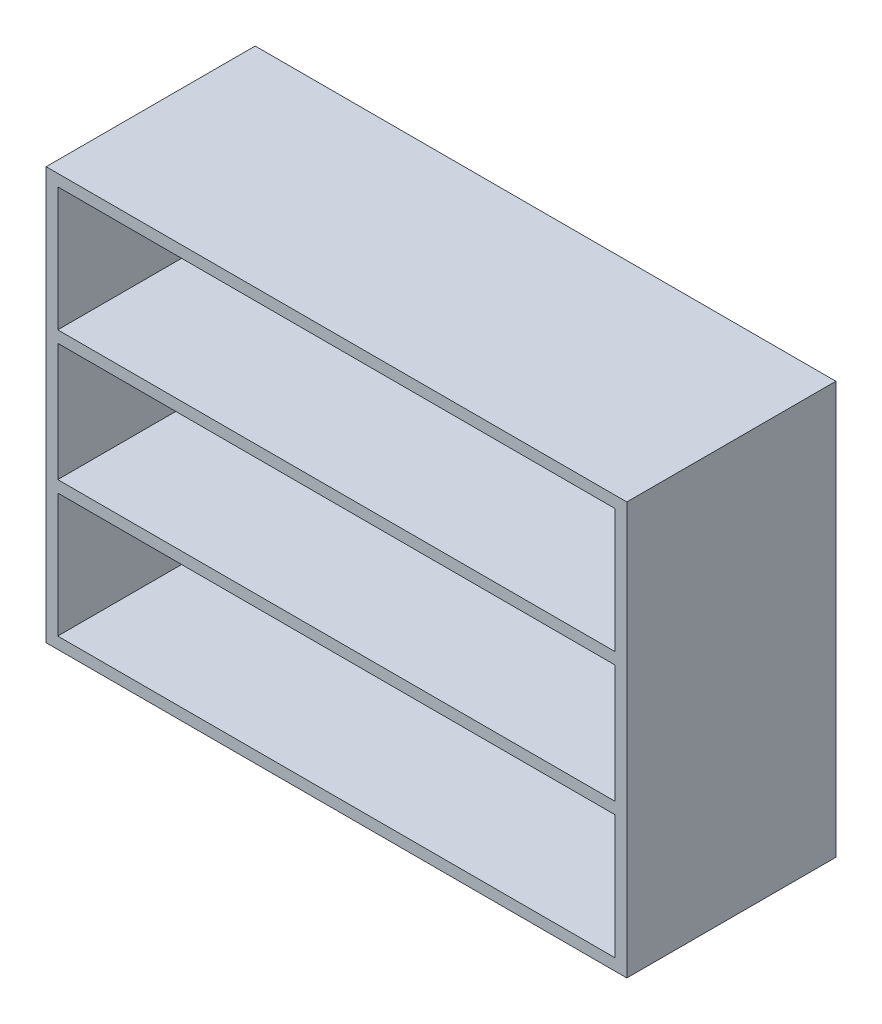
ISO-10303-21;
HEADER;
FILE_DESCRIPTION(('STEP AP214'),'2;1');
FILE_NAME('part.step','',(''),(''),'','','');
FILE_SCHEMA(('AUTOMOTIVE_DESIGN { 1 0 10303 214 1 1 1 1 }'));
ENDSEC;
DATA;
#1=APPLICATION_CONTEXT('core data for automotive mechanical design processes');
#2=APPLICATION_PROTOCOL_DEFINITION('international standard','automotive_design',2000,#1);
#3=PRODUCT_CONTEXT('',#1,'mechanical');
#4=PRODUCT('Part','Part','',(#3));
#5=PRODUCT_RELATED_PRODUCT_CATEGORY('part','',(#4));
#6=PRODUCT_DEFINITION_FORMATION('','',#4);
#7=PRODUCT_DEFINITION_CONTEXT('part definition',#1,'design');
#8=PRODUCT_DEFINITION('design','',#6,#7);
#9=PRODUCT_DEFINITION_SHAPE('','',#8);
#10=(LENGTH_UNIT() NAMED_UNIT(*) SI_UNIT(.MILLI.,.METRE.));
#11=(NAMED_UNIT(*) PLANE_ANGLE_UNIT() SI_UNIT($,.RADIAN.));
#12=(NAMED_UNIT(*) SI_UNIT($,.STERADIAN.) SOLID_ANGLE_UNIT());
#13=UNCERTAINTY_MEASURE_WITH_UNIT(LENGTH_MEASURE(1.E-05),#10,'distance_accuracy_value','');
#14=(GEOMETRIC_REPRESENTATION_CONTEXT(3) GLOBAL_UNCERTAINTY_ASSIGNED_CONTEXT((#13)) GLOBAL_UNIT_ASSIGNED_CONTEXT((#10,
#11,#12)) REPRESENTATION_CONTEXT('',''));
#15=CARTESIAN_POINT('',(0.,0.,0.));
#16=DIRECTION('',(0.,0.,1.));
#17=DIRECTION('',(1.,0.,0.));
#18=AXIS2_PLACEMENT_3D('',#15,#16,#17);
#19=CARTESIAN_POINT('',(1270.,1803.4,-457.2));
#20=DIRECTION('',(-1.,0.,0.));
#21=DIRECTION('',(0.,0.,1.));
#22=AXIS2_PLACEMENT_3D('',#19,#20,#21);
#23=PLANE('',#22);
#24=DIRECTION('',(0.,0.,-1.));
#25=VECTOR('',#24,1.);
#26=CARTESIAN_POINT('',(1270.,0.,-457.2));
#27=LINE('',#26,#25);
#28=CARTESIAN_POINT('',(1270.,0.,457.2));
#29=VERTEX_POINT('',#28);
#30=CARTESIAN_POINT('',(1270.,0.,-457.2));
#31=VERTEX_POINT('',#30);
#32=EDGE_CURVE('E182',#29,#31,#27,.T.);
#33=ORIENTED_EDGE('',*,*,#32,.T.);
#34=DIRECTION('',(0.,-1.,0.));
#35=VECTOR('',#34,1.);
#36=CARTESIAN_POINT('',(1270.,1803.4,-457.2));
#37=LINE('',#36,#35);
#38=CARTESIAN_POINT('',(1270.,1803.4,-457.2));
#39=VERTEX_POINT('',#38);
#40=EDGE_CURVE('E11',#39,#31,#37,.T.);
#41=ORIENTED_EDGE('',*,*,#40,.F.);
#42=DIRECTION('',(0.,0.,-1.));
#43=VECTOR('',#42,1.);
#44=CARTESIAN_POINT('',(1270.,1803.4,-457.2));
#45=LINE('',#44,#43);
#46=CARTESIAN_POINT('',(1270.,1803.4,457.2));
#47=VERTEX_POINT('',#46);
#48=EDGE_CURVE('E247',#47,#39,#45,.T.);
#49=ORIENTED_EDGE('',*,*,#48,.F.);
#50=DIRECTION('',(0.,-1.,0.));
#51=VECTOR('',#50,1.);
#52=CARTESIAN_POINT('',(1270.,1803.4,457.2));
#53=LINE('',#52,#51);
#54=EDGE_CURVE('E257',#47,#29,#53,.T.);
#55=ORIENTED_EDGE('',*,*,#54,.T.);
#56=EDGE_LOOP('',(#33,#41,#49,#55));
#57=FACE_BOUND('',#56,.T.);
#58=ADVANCED_FACE('F32',(#57),#23,.F.);
#59=CARTESIAN_POINT('',(-1270.,1803.4,-457.2));
#60=DIRECTION('',(0.,0.,1.));
#61=DIRECTION('',(1.,0.,0.));
#62=AXIS2_PLACEMENT_3D('',#59,#60,#61);
#63=PLANE('',#62);
#64=DIRECTION('',(-1.,0.,0.));
#65=VECTOR('',#64,1.);
#66=CARTESIAN_POINT('',(-1219.2,592.666666666667,-457.2));
#67=LINE('',#66,#65);
#68=CARTESIAN_POINT('',(1219.2,592.666666666667,-457.2));
#69=VERTEX_POINT('',#68);
#70=CARTESIAN_POINT('',(-1219.2,592.666666666667,-457.2));
#71=VERTEX_POINT('',#70);
#72=EDGE_CURVE('E156',#69,#71,#67,.T.);
#73=ORIENTED_EDGE('',*,*,#72,.T.);
#74=DIRECTION('',(0.,-1.,0.));
#75=VECTOR('',#74,1.);
#76=CARTESIAN_POINT('',(-1219.2,592.666666666667,-457.2));
#77=LINE('',#76,#75);
#78=CARTESIAN_POINT('',(-1219.2,50.8,-457.2));
#79=VERTEX_POINT('',#78);
#80=EDGE_CURVE('E148',#71,#79,#77,.T.);
#81=ORIENTED_EDGE('',*,*,#80,.T.);
#82=DIRECTION('',(1.,0.,0.));
#83=VECTOR('',#82,1.);
#84=CARTESIAN_POINT('',(-1219.2,50.8,-457.2));
#85=LINE('',#84,#83);
#86=CARTESIAN_POINT('',(1219.2,50.8000000000001,-457.2));
#87=VERTEX_POINT('',#86);
#88=EDGE_CURVE('E159',#79,#87,#85,.T.);
#89=ORIENTED_EDGE('',*,*,#88,.T.);
#90=DIRECTION('',(0.,1.,0.));
#91=VECTOR('',#90,1.);
#92=CARTESIAN_POINT('',(1219.2,50.8000000000001,-457.2));
#93=LINE('',#92,#91);
#94=EDGE_CURVE('E46',#87,#69,#93,.T.);
#95=ORIENTED_EDGE('',*,*,#94,.T.);
#96=EDGE_LOOP('',(#73,#81,#89,#95));
#97=FACE_BOUND('',#96,.T.);
#98=DIRECTION('',(1.,0.,0.));
#99=VECTOR('',#98,1.);
#100=CARTESIAN_POINT('',(-1219.2,1210.73333333333,-457.2));
#101=LINE('',#100,#99);
#102=CARTESIAN_POINT('',(-1219.2,1210.73333333333,-457.2));
#103=VERTEX_POINT('',#102);
#104=CARTESIAN_POINT('',(1219.2,1210.73333333333,-457.2));
#105=VERTEX_POINT('',#104);
#106=EDGE_CURVE('E194',#103,#105,#101,.T.);
#107=ORIENTED_EDGE('',*,*,#106,.T.);
#108=DIRECTION('',(0.,1.,0.));
#109=VECTOR('',#108,1.);
#110=CARTESIAN_POINT('',(1219.2,1210.73333333333,-457.2));
#111=LINE('',#110,#109);
#112=CARTESIAN_POINT('',(1219.2,1752.6,-457.2));
#113=VERTEX_POINT('',#112);
#114=EDGE_CURVE('E186',#105,#113,#111,.T.);
#115=ORIENTED_EDGE('',*,*,#114,.T.);
#116=DIRECTION('',(-1.,0.,0.));
#117=VECTOR('',#116,1.);
#118=CARTESIAN_POINT('',(1219.2,1752.6,-457.2));
#119=LINE('',#118,#117);
#120=CARTESIAN_POINT('',(-1219.2,1752.6,-457.2));
#121=VERTEX_POINT('',#120);
#122=EDGE_CURVE('E189',#113,#121,#119,.T.);
#123=ORIENTED_EDGE('',*,*,#122,.T.);
#124=DIRECTION('',(0.,-1.,0.));
#125=VECTOR('',#124,1.);
#126=CARTESIAN_POINT('',(-1219.2,1752.6,-457.2));
#127=LINE('',#126,#125);
#128=EDGE_CURVE('E54',#121,#103,#127,.T.);
#129=ORIENTED_EDGE('',*,*,#128,.T.);
#130=EDGE_LOOP('',(#107,#115,#123,#129));
#131=FACE_BOUND('',#130,.T.);
#132=DIRECTION('',(-1.,0.,0.));
#133=VECTOR('',#132,1.);
#134=CARTESIAN_POINT('',(-1219.2,1159.93333333333,-457.2));
#135=LINE('',#134,#133);
#136=CARTESIAN_POINT('',(1219.2,1159.93333333333,-457.2));
#137=VERTEX_POINT('',#136);
#138=CARTESIAN_POINT('',(-1219.2,1159.93333333333,-457.2));
#139=VERTEX_POINT('',#138);
#140=EDGE_CURVE('E226',#137,#139,#135,.T.);
#141=ORIENTED_EDGE('',*,*,#140,.T.);
#142=DIRECTION('',(0.,-1.,0.));
#143=VECTOR('',#142,1.);
#144=CARTESIAN_POINT('',(-1219.2,1159.93333333333,-457.2));
#145=LINE('',#144,#143);
#146=CARTESIAN_POINT('',(-1219.2,643.466666666667,-457.2));
#147=VERTEX_POINT('',#146);
#148=EDGE_CURVE('E216',#139,#147,#145,.T.);
#149=ORIENTED_EDGE('',*,*,#148,.T.);
#150=DIRECTION('',(1.,0.,0.));
#151=VECTOR('',#150,1.);
#152=CARTESIAN_POINT('',(-1219.2,643.466666666667,-457.2));
#153=LINE('',#152,#151);
#154=CARTESIAN_POINT('',(1219.2,643.466666666667,-457.2));
#155=VERTEX_POINT('',#154);
#156=EDGE_CURVE('E219',#147,#155,#153,.T.);
#157=ORIENTED_EDGE('',*,*,#156,.T.);
#158=DIRECTION('',(0.,1.,0.));
#159=VECTOR('',#158,1.);
#160=CARTESIAN_POINT('',(1219.2,643.466666666667,-457.2));
#161=LINE('',#160,#159);
#162=EDGE_CURVE('E223',#155,#137,#161,.T.);
#163=ORIENTED_EDGE('',*,*,#162,.T.);
#164=EDGE_LOOP('',(#141,#149,#157,#163));
#165=FACE_BOUND('',#164,.T.);
#166=DIRECTION('',(-1.,0.,0.));
#167=VECTOR('',#166,1.);
#168=CARTESIAN_POINT('',(-1270.,0.,-457.2));
#169=LINE('',#168,#167);
#170=CARTESIAN_POINT('',(-1270.,0.,-457.2));
#171=VERTEX_POINT('',#170);
#172=EDGE_CURVE('E260',#31,#171,#169,.T.);
#173=ORIENTED_EDGE('',*,*,#172,.T.);
#174=DIRECTION('',(0.,-1.,0.));
#175=VECTOR('',#174,1.);
#176=CARTESIAN_POINT('',(-1270.,1803.4,-457.2));
#177=LINE('',#176,#175);
#178=CARTESIAN_POINT('',(-1270.,1803.4,-457.2));
#179=VERTEX_POINT('',#178);
#180=EDGE_CURVE('E39',#179,#171,#177,.T.);
#181=ORIENTED_EDGE('',*,*,#180,.F.);
#182=DIRECTION('',(-1.,0.,0.));
#183=VECTOR('',#182,1.);
#184=CARTESIAN_POINT('',(-1270.,1803.4,-457.2));
#185=LINE('',#184,#183);
#186=EDGE_CURVE('E250',#39,#179,#185,.T.);
#187=ORIENTED_EDGE('',*,*,#186,.F.);
#188=ORIENTED_EDGE('',*,*,#40,.T.);
#189=EDGE_LOOP('',(#173,#181,#187,#188));
#190=FACE_BOUND('',#189,.T.);
#191=ADVANCED_FACE('F163',(#97,#131,#165,#190),#63,.F.);
#192=CARTESIAN_POINT('',(-1270.,1803.4,-457.2));
#193=DIRECTION('',(1.,0.,0.));
#194=DIRECTION('',(0.,0.,-1.));
#195=AXIS2_PLACEMENT_3D('',#192,#193,#194);
#196=PLANE('',#195);
#197=DIRECTION('',(0.,0.,1.));
#198=VECTOR('',#197,1.);
#199=CARTESIAN_POINT('',(-1270.,0.,-457.2));
#200=LINE('',#199,#198);
#201=CARTESIAN_POINT('',(-1270.,0.,457.2));
#202=VERTEX_POINT('',#201);
#203=EDGE_CURVE('E262',#171,#202,#200,.T.);
#204=ORIENTED_EDGE('',*,*,#203,.T.);
#205=DIRECTION('',(0.,-1.,0.));
#206=VECTOR('',#205,1.);
#207=CARTESIAN_POINT('',(-1270.,1803.4,457.2));
#208=LINE('',#207,#206);
#209=CARTESIAN_POINT('',(-1270.,1803.4,457.2));
#210=VERTEX_POINT('',#209);
#211=EDGE_CURVE('E267',#210,#202,#208,.T.);
#212=ORIENTED_EDGE('',*,*,#211,.F.);
#213=DIRECTION('',(0.,0.,1.));
#214=VECTOR('',#213,1.);
#215=CARTESIAN_POINT('',(-1270.,1803.4,-457.2));
#216=LINE('',#215,#214);
#217=EDGE_CURVE('E253',#179,#210,#216,.T.);
#218=ORIENTED_EDGE('',*,*,#217,.F.);
#219=ORIENTED_EDGE('',*,*,#180,.T.);
#220=EDGE_LOOP('',(#204,#212,#218,#219));
#221=FACE_BOUND('',#220,.T.);
#222=ADVANCED_FACE('F274',(#221),#196,.F.);
#223=CARTESIAN_POINT('',(-1270.,1803.4,457.2));
#224=DIRECTION('',(0.,0.,-1.));
#225=DIRECTION('',(-1.,0.,0.));
#226=AXIS2_PLACEMENT_3D('',#223,#224,#225);
#227=PLANE('',#226);
#228=DIRECTION('',(1.,0.,0.));
#229=VECTOR('',#228,1.);
#230=CARTESIAN_POINT('',(-1219.2,50.8,457.2));
#231=LINE('',#230,#229);
#232=CARTESIAN_POINT('',(-1219.2,50.8,457.2));
#233=VERTEX_POINT('',#232);
#234=CARTESIAN_POINT('',(1219.2,50.8000000000001,457.2));
#235=VERTEX_POINT('',#234);
#236=EDGE_CURVE('E175',#233,#235,#231,.T.);
#237=ORIENTED_EDGE('',*,*,#236,.F.);
#238=DIRECTION('',(0.,-1.,0.));
#239=VECTOR('',#238,1.);
#240=CARTESIAN_POINT('',(-1219.2,592.666666666667,457.2));
#241=LINE('',#240,#239);
#242=CARTESIAN_POINT('',(-1219.2,592.666666666667,457.2));
#243=VERTEX_POINT('',#242);
#244=EDGE_CURVE('E151',#243,#233,#241,.T.);
#245=ORIENTED_EDGE('',*,*,#244,.F.);
#246=DIRECTION('',(-1.,0.,0.));
#247=VECTOR('',#246,1.);
#248=CARTESIAN_POINT('',(-1219.2,592.666666666667,457.2));
#249=LINE('',#248,#247);
#250=CARTESIAN_POINT('',(1219.2,592.666666666667,457.2));
#251=VERTEX_POINT('',#250);
#252=EDGE_CURVE('E166',#251,#243,#249,.T.);
#253=ORIENTED_EDGE('',*,*,#252,.F.);
#254=DIRECTION('',(0.,1.,0.));
#255=VECTOR('',#254,1.);
#256=CARTESIAN_POINT('',(1219.2,50.8000000000001,457.2));
#257=LINE('',#256,#255);
#258=EDGE_CURVE('E169',#235,#251,#257,.T.);
#259=ORIENTED_EDGE('',*,*,#258,.F.);
#260=EDGE_LOOP('',(#237,#245,#253,#259));
#261=FACE_BOUND('',#260,.T.);
#262=DIRECTION('',(-1.,0.,0.));
#263=VECTOR('',#262,1.);
#264=CARTESIAN_POINT('',(1219.2,1752.6,457.2));
#265=LINE('',#264,#263);
#266=CARTESIAN_POINT('',(1219.2,1752.6,457.2));
#267=VERTEX_POINT('',#266);
#268=CARTESIAN_POINT('',(-1219.2,1752.6,457.2));
#269=VERTEX_POINT('',#268);
#270=EDGE_CURVE('E200',#267,#269,#265,.T.);
#271=ORIENTED_EDGE('',*,*,#270,.F.);
#272=DIRECTION('',(0.,1.,0.));
#273=VECTOR('',#272,1.);
#274=CARTESIAN_POINT('',(1219.2,1210.73333333333,457.2));
#275=LINE('',#274,#273);
#276=CARTESIAN_POINT('',(1219.2,1210.73333333333,457.2));
#277=VERTEX_POINT('',#276);
#278=EDGE_CURVE('E198',#277,#267,#275,.T.);
#279=ORIENTED_EDGE('',*,*,#278,.F.);
#280=DIRECTION('',(1.,0.,0.));
#281=VECTOR('',#280,1.);
#282=CARTESIAN_POINT('',(-1219.2,1210.73333333333,457.2));
#283=LINE('',#282,#281);
#284=CARTESIAN_POINT('',(-1219.2,1210.73333333333,457.2));
#285=VERTEX_POINT('',#284);
#286=EDGE_CURVE('E190',#285,#277,#283,.T.);
#287=ORIENTED_EDGE('',*,*,#286,.F.);
#288=DIRECTION('',(0.,-1.,0.));
#289=VECTOR('',#288,1.);
#290=CARTESIAN_POINT('',(-1219.2,1752.6,457.2));
#291=LINE('',#290,#289);
#292=EDGE_CURVE('E204',#269,#285,#291,.T.);
#293=ORIENTED_EDGE('',*,*,#292,.F.);
#294=EDGE_LOOP('',(#271,#279,#287,#293));
#295=FACE_BOUND('',#294,.T.);
#296=DIRECTION('',(1.,0.,0.));
#297=VECTOR('',#296,1.);
#298=CARTESIAN_POINT('',(-1219.2,643.466666666667,457.2));
#299=LINE('',#298,#297);
#300=CARTESIAN_POINT('',(-1219.2,643.466666666667,457.2));
#301=VERTEX_POINT('',#300);
#302=CARTESIAN_POINT('',(1219.2,643.466666666667,457.2));
#303=VERTEX_POINT('',#302);
#304=EDGE_CURVE('E232',#301,#303,#299,.T.);
#305=ORIENTED_EDGE('',*,*,#304,.F.);
#306=DIRECTION('',(0.,-1.,0.));
#307=VECTOR('',#306,1.);
#308=CARTESIAN_POINT('',(-1219.2,1159.93333333333,457.2));
#309=LINE('',#308,#307);
#310=CARTESIAN_POINT('',(-1219.2,1159.93333333333,457.2));
#311=VERTEX_POINT('',#310);
#312=EDGE_CURVE('E230',#311,#301,#309,.T.);
#313=ORIENTED_EDGE('',*,*,#312,.F.);
#314=DIRECTION('',(-1.,0.,0.));
#315=VECTOR('',#314,1.);
#316=CARTESIAN_POINT('',(-1219.2,1159.93333333333,457.2));
#317=LINE('',#316,#315);
#318=CARTESIAN_POINT('',(1219.2,1159.93333333333,457.2));
#319=VERTEX_POINT('',#318);
#320=EDGE_CURVE('E220',#319,#311,#317,.T.);
#321=ORIENTED_EDGE('',*,*,#320,.F.);
#322=DIRECTION('',(0.,1.,0.));
#323=VECTOR('',#322,1.);
#324=CARTESIAN_POINT('',(1219.2,643.466666666667,457.2));
#325=LINE('',#324,#323);
#326=EDGE_CURVE('E235',#303,#319,#325,.T.);
#327=ORIENTED_EDGE('',*,*,#326,.F.);
#328=EDGE_LOOP('',(#305,#313,#321,#327));
#329=FACE_BOUND('',#328,.T.);
#330=DIRECTION('',(1.,0.,0.));
#331=VECTOR('',#330,1.);
#332=CARTESIAN_POINT('',(-1270.,0.,457.2));
#333=LINE('',#332,#331);
#334=EDGE_CURVE('E251',#202,#29,#333,.T.);
#335=ORIENTED_EDGE('',*,*,#334,.T.);
#336=ORIENTED_EDGE('',*,*,#54,.F.);
#337=DIRECTION('',(1.,0.,0.));
#338=VECTOR('',#337,1.);
#339=CARTESIAN_POINT('',(-1270.,1803.4,457.2));
#340=LINE('',#339,#338);
#341=EDGE_CURVE('E255',#210,#47,#340,.T.);
#342=ORIENTED_EDGE('',*,*,#341,.F.);
#343=ORIENTED_EDGE('',*,*,#211,.T.);
#344=EDGE_LOOP('',(#335,#336,#342,#343));
#345=FACE_BOUND('',#344,.T.);
#346=ADVANCED_FACE('F283',(#261,#295,#329,#345),#227,.F.);
#347=CARTESIAN_POINT('',(0.,1803.4,0.));
#348=DIRECTION('',(0.,1.,0.));
#349=DIRECTION('',(0.,0.,1.));
#350=AXIS2_PLACEMENT_3D('',#347,#348,#349);
#351=PLANE('',#350);
#352=ORIENTED_EDGE('',*,*,#48,.T.);
#353=ORIENTED_EDGE('',*,*,#186,.T.);
#354=ORIENTED_EDGE('',*,*,#217,.T.);
#355=ORIENTED_EDGE('',*,*,#341,.T.);
#356=EDGE_LOOP('',(#352,#353,#354,#355));
#357=FACE_BOUND('',#356,.T.);
#358=ADVANCED_FACE('F289',(#357),#351,.T.);
#359=CARTESIAN_POINT('',(0.,0.,0.));
#360=DIRECTION('',(0.,1.,0.));
#361=DIRECTION('',(0.,0.,1.));
#362=AXIS2_PLACEMENT_3D('',#359,#360,#361);
#363=PLANE('',#362);
#364=ORIENTED_EDGE('',*,*,#32,.F.);
#365=ORIENTED_EDGE('',*,*,#334,.F.);
#366=ORIENTED_EDGE('',*,*,#203,.F.);
#367=ORIENTED_EDGE('',*,*,#172,.F.);
#368=EDGE_LOOP('',(#364,#365,#366,#367));
#369=FACE_BOUND('',#368,.T.);
#370=ADVANCED_FACE('F280',(#369),#363,.F.);
#371=CARTESIAN_POINT('',(-1219.2,1159.93333333333,-457.2));
#372=DIRECTION('',(-1.,0.,0.));
#373=DIRECTION('',(0.,-1.,0.));
#374=AXIS2_PLACEMENT_3D('',#371,#372,#373);
#375=PLANE('',#374);
#376=ORIENTED_EDGE('',*,*,#312,.T.);
#377=DIRECTION('',(0.,0.,1.));
#378=VECTOR('',#377,1.);
#379=CARTESIAN_POINT('',(-1219.2,643.466666666667,-457.2));
#380=LINE('',#379,#378);
#381=EDGE_CURVE('E229',#147,#301,#380,.T.);
#382=ORIENTED_EDGE('',*,*,#381,.F.);
#383=ORIENTED_EDGE('',*,*,#148,.F.);
#384=DIRECTION('',(0.,0.,1.));
#385=VECTOR('',#384,1.);
#386=CARTESIAN_POINT('',(-1219.2,1159.93333333333,-457.2));
#387=LINE('',#386,#385);
#388=EDGE_CURVE('E201',#139,#311,#387,.T.);
#389=ORIENTED_EDGE('',*,*,#388,.T.);
#390=EDGE_LOOP('',(#376,#382,#383,#389));
#391=FACE_BOUND('',#390,.T.);
#392=ADVANCED_FACE('F302',(#391),#375,.F.);
#393=CARTESIAN_POINT('',(-1219.2,1159.93333333333,-457.2));
#394=DIRECTION('',(0.,1.,0.));
#395=DIRECTION('',(0.,0.,1.));
#396=AXIS2_PLACEMENT_3D('',#393,#394,#395);
#397=PLANE('',#396);
#398=ORIENTED_EDGE('',*,*,#320,.T.);
#399=ORIENTED_EDGE('',*,*,#388,.F.);
#400=ORIENTED_EDGE('',*,*,#140,.F.);
#401=DIRECTION('',(0.,0.,1.));
#402=VECTOR('',#401,1.);
#403=CARTESIAN_POINT('',(1219.2,1159.93333333333,-457.2));
#404=LINE('',#403,#402);
#405=EDGE_CURVE('E241',#137,#319,#404,.T.);
#406=ORIENTED_EDGE('',*,*,#405,.T.);
#407=EDGE_LOOP('',(#398,#399,#400,#406));
#408=FACE_BOUND('',#407,.T.);
#409=ADVANCED_FACE('F307',(#408),#397,.F.);
#410=CARTESIAN_POINT('',(1219.2,643.466666666667,-457.2));
#411=DIRECTION('',(1.,0.,0.));
#412=DIRECTION('',(0.,1.,0.));
#413=AXIS2_PLACEMENT_3D('',#410,#411,#412);
#414=PLANE('',#413);
#415=ORIENTED_EDGE('',*,*,#326,.T.);
#416=ORIENTED_EDGE('',*,*,#405,.F.);
#417=ORIENTED_EDGE('',*,*,#162,.F.);
#418=DIRECTION('',(0.,0.,1.));
#419=VECTOR('',#418,1.);
#420=CARTESIAN_POINT('',(1219.2,643.466666666667,-457.2));
#421=LINE('',#420,#419);
#422=EDGE_CURVE('E243',#155,#303,#421,.T.);
#423=ORIENTED_EDGE('',*,*,#422,.T.);
#424=EDGE_LOOP('',(#415,#416,#417,#423));
#425=FACE_BOUND('',#424,.T.);
#426=ADVANCED_FACE('F313',(#425),#414,.F.);
#427=CARTESIAN_POINT('',(-1219.2,643.466666666667,-457.2));
#428=DIRECTION('',(0.,-1.,0.));
#429=DIRECTION('',(0.,0.,-1.));
#430=AXIS2_PLACEMENT_3D('',#427,#428,#429);
#431=PLANE('',#430);
#432=ORIENTED_EDGE('',*,*,#304,.T.);
#433=ORIENTED_EDGE('',*,*,#422,.F.);
#434=ORIENTED_EDGE('',*,*,#156,.F.);
#435=ORIENTED_EDGE('',*,*,#381,.T.);
#436=EDGE_LOOP('',(#432,#433,#434,#435));
#437=FACE_BOUND('',#436,.T.);
#438=ADVANCED_FACE('F309',(#437),#431,.F.);
#439=CARTESIAN_POINT('',(1219.2,1210.73333333333,-457.2));
#440=DIRECTION('',(1.,0.,0.));
#441=DIRECTION('',(0.,1.,0.));
#442=AXIS2_PLACEMENT_3D('',#439,#440,#441);
#443=PLANE('',#442);
#444=ORIENTED_EDGE('',*,*,#278,.T.);
#445=DIRECTION('',(0.,0.,1.));
#446=VECTOR('',#445,1.);
#447=CARTESIAN_POINT('',(1219.2,1752.6,-457.2));
#448=LINE('',#447,#446);
#449=EDGE_CURVE('E197',#113,#267,#448,.T.);
#450=ORIENTED_EDGE('',*,*,#449,.F.);
#451=ORIENTED_EDGE('',*,*,#114,.F.);
#452=DIRECTION('',(0.,0.,1.));
#453=VECTOR('',#452,1.);
#454=CARTESIAN_POINT('',(1219.2,1210.73333333333,-457.2));
#455=LINE('',#454,#453);
#456=EDGE_CURVE('E176',#105,#277,#455,.T.);
#457=ORIENTED_EDGE('',*,*,#456,.T.);
#458=EDGE_LOOP('',(#444,#450,#451,#457));
#459=FACE_BOUND('',#458,.T.);
#460=ADVANCED_FACE('F312',(#459),#443,.F.);
#461=CARTESIAN_POINT('',(-1219.2,1210.73333333333,-457.2));
#462=DIRECTION('',(0.,-1.,0.));
#463=DIRECTION('',(0.,0.,-1.));
#464=AXIS2_PLACEMENT_3D('',#461,#462,#463);
#465=PLANE('',#464);
#466=ORIENTED_EDGE('',*,*,#286,.T.);
#467=ORIENTED_EDGE('',*,*,#456,.F.);
#468=ORIENTED_EDGE('',*,*,#106,.F.);
#469=DIRECTION('',(0.,0.,1.));
#470=VECTOR('',#469,1.);
#471=CARTESIAN_POINT('',(-1219.2,1210.73333333333,-457.2));
#472=LINE('',#471,#470);
#473=EDGE_CURVE('E210',#103,#285,#472,.T.);
#474=ORIENTED_EDGE('',*,*,#473,.T.);
#475=EDGE_LOOP('',(#466,#467,#468,#474));
#476=FACE_BOUND('',#475,.T.);
#477=ADVANCED_FACE('F323',(#476),#465,.F.);
#478=CARTESIAN_POINT('',(-1219.2,1752.6,-457.2));
#479=DIRECTION('',(-1.,0.,0.));
#480=DIRECTION('',(0.,-1.,0.));
#481=AXIS2_PLACEMENT_3D('',#478,#479,#480);
#482=PLANE('',#481);
#483=ORIENTED_EDGE('',*,*,#292,.T.);
#484=ORIENTED_EDGE('',*,*,#473,.F.);
#485=ORIENTED_EDGE('',*,*,#128,.F.);
#486=DIRECTION('',(0.,0.,1.));
#487=VECTOR('',#486,1.);
#488=CARTESIAN_POINT('',(-1219.2,1752.6,-457.2));
#489=LINE('',#488,#487);
#490=EDGE_CURVE('E212',#121,#269,#489,.T.);
#491=ORIENTED_EDGE('',*,*,#490,.T.);
#492=EDGE_LOOP('',(#483,#484,#485,#491));
#493=FACE_BOUND('',#492,.T.);
#494=ADVANCED_FACE('F328',(#493),#482,.F.);
#495=CARTESIAN_POINT('',(1219.2,1752.6,-457.2));
#496=DIRECTION('',(0.,1.,0.));
#497=DIRECTION('',(-1.,0.,0.));
#498=AXIS2_PLACEMENT_3D('',#495,#496,#497);
#499=PLANE('',#498);
#500=ORIENTED_EDGE('',*,*,#270,.T.);
#501=ORIENTED_EDGE('',*,*,#490,.F.);
#502=ORIENTED_EDGE('',*,*,#122,.F.);
#503=ORIENTED_EDGE('',*,*,#449,.T.);
#504=EDGE_LOOP('',(#500,#501,#502,#503));
#505=FACE_BOUND('',#504,.T.);
#506=ADVANCED_FACE('F325',(#505),#499,.F.);
#507=CARTESIAN_POINT('',(-1219.2,592.666666666667,-457.2));
#508=DIRECTION('',(-1.,0.,0.));
#509=DIRECTION('',(0.,-1.,0.));
#510=AXIS2_PLACEMENT_3D('',#507,#508,#509);
#511=PLANE('',#510);
#512=ORIENTED_EDGE('',*,*,#244,.T.);
#513=DIRECTION('',(0.,0.,1.));
#514=VECTOR('',#513,1.);
#515=CARTESIAN_POINT('',(-1219.2,50.8,-457.2));
#516=LINE('',#515,#514);
#517=EDGE_CURVE('E144',#79,#233,#516,.T.);
#518=ORIENTED_EDGE('',*,*,#517,.F.);
#519=ORIENTED_EDGE('',*,*,#80,.F.);
#520=DIRECTION('',(0.,0.,1.));
#521=VECTOR('',#520,1.);
#522=CARTESIAN_POINT('',(-1219.2,592.666666666667,-457.2));
#523=LINE('',#522,#521);
#524=EDGE_CURVE('E180',#71,#243,#523,.T.);
#525=ORIENTED_EDGE('',*,*,#524,.T.);
#526=EDGE_LOOP('',(#512,#518,#519,#525));
#527=FACE_BOUND('',#526,.T.);
#528=ADVANCED_FACE('F146',(#527),#511,.F.);
#529=CARTESIAN_POINT('',(-1219.2,592.666666666667,-457.2));
#530=DIRECTION('',(0.,1.,0.));
#531=DIRECTION('',(0.,0.,1.));
#532=AXIS2_PLACEMENT_3D('',#529,#530,#531);
#533=PLANE('',#532);
#534=ORIENTED_EDGE('',*,*,#252,.T.);
#535=ORIENTED_EDGE('',*,*,#524,.F.);
#536=ORIENTED_EDGE('',*,*,#72,.F.);
#537=DIRECTION('',(0.,0.,1.));
#538=VECTOR('',#537,1.);
#539=CARTESIAN_POINT('',(1219.2,592.666666666667,-457.2));
#540=LINE('',#539,#538);
#541=EDGE_CURVE('E183',#69,#251,#540,.T.);
#542=ORIENTED_EDGE('',*,*,#541,.T.);
#543=EDGE_LOOP('',(#534,#535,#536,#542));
#544=FACE_BOUND('',#543,.T.);
#545=ADVANCED_FACE('F337',(#544),#533,.F.);
#546=CARTESIAN_POINT('',(1219.2,50.8000000000001,-457.2));
#547=DIRECTION('',(1.,0.,0.));
#548=DIRECTION('',(0.,1.,0.));
#549=AXIS2_PLACEMENT_3D('',#546,#547,#548);
#550=PLANE('',#549);
#551=ORIENTED_EDGE('',*,*,#258,.T.);
#552=ORIENTED_EDGE('',*,*,#541,.F.);
#553=ORIENTED_EDGE('',*,*,#94,.F.);
#554=DIRECTION('',(0.,0.,1.));
#555=VECTOR('',#554,1.);
#556=CARTESIAN_POINT('',(1219.2,50.8000000000001,-457.2));
#557=LINE('',#556,#555);
#558=EDGE_CURVE('E155',#87,#235,#557,.T.);
#559=ORIENTED_EDGE('',*,*,#558,.T.);
#560=EDGE_LOOP('',(#551,#552,#553,#559));
#561=FACE_BOUND('',#560,.T.);
#562=ADVANCED_FACE('F340',(#561),#550,.F.);
#563=CARTESIAN_POINT('',(-1219.2,50.8,-457.2));
#564=DIRECTION('',(0.,-1.,0.));
#565=DIRECTION('',(1.,0.,0.));
#566=AXIS2_PLACEMENT_3D('',#563,#564,#565);
#567=PLANE('',#566);
#568=ORIENTED_EDGE('',*,*,#236,.T.);
#569=ORIENTED_EDGE('',*,*,#558,.F.);
#570=ORIENTED_EDGE('',*,*,#88,.F.);
#571=ORIENTED_EDGE('',*,*,#517,.T.);
#572=EDGE_LOOP('',(#568,#569,#570,#571));
#573=FACE_BOUND('',#572,.T.);
#574=ADVANCED_FACE('F160',(#573),#567,.F.);
#575=CLOSED_SHELL('',(#58,#191,#222,#346,#358,#370,#392,#409,#426,#438,#460,#477,#494,#506,#528,
#545,#562,#574));
#576=MANIFOLD_SOLID_BREP('B2',#575);
#577=ADVANCED_BREP_SHAPE_REPRESENTATION('',(#18,#576),#14);
#578=SHAPE_DEFINITION_REPRESENTATION(#9,#577);
ENDSEC;
END-ISO-10303-21;
